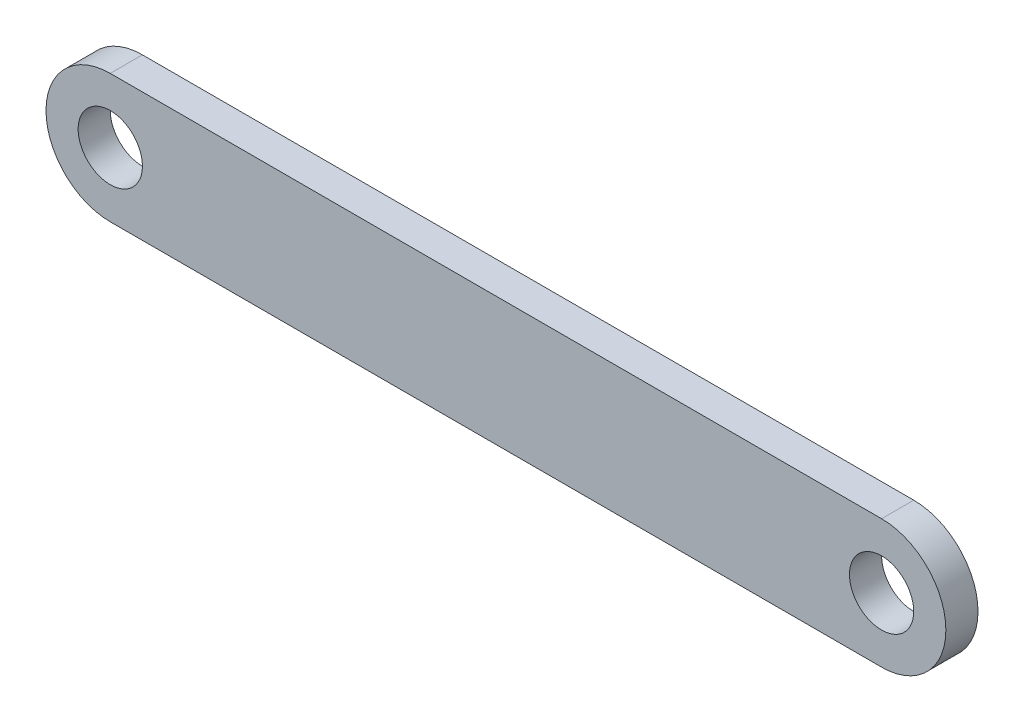
ISO-10303-21;
HEADER;
FILE_DESCRIPTION(('STEP AP214'),'2;1');
FILE_NAME('part.step','',(''),(''),'','','');
FILE_SCHEMA(('AUTOMOTIVE_DESIGN { 1 0 10303 214 1 1 1 1 }'));
ENDSEC;
DATA;
#1=APPLICATION_CONTEXT('core data for automotive mechanical design processes');
#2=APPLICATION_PROTOCOL_DEFINITION('international standard','automotive_design',2000,#1);
#3=PRODUCT_CONTEXT('',#1,'mechanical');
#4=PRODUCT('Part','Part','',(#3));
#5=PRODUCT_RELATED_PRODUCT_CATEGORY('part','',(#4));
#6=PRODUCT_DEFINITION_FORMATION('','',#4);
#7=PRODUCT_DEFINITION_CONTEXT('part definition',#1,'design');
#8=PRODUCT_DEFINITION('design','',#6,#7);
#9=PRODUCT_DEFINITION_SHAPE('','',#8);
#10=(LENGTH_UNIT() NAMED_UNIT(*) SI_UNIT(.MILLI.,.METRE.));
#11=(NAMED_UNIT(*) PLANE_ANGLE_UNIT() SI_UNIT($,.RADIAN.));
#12=(NAMED_UNIT(*) SI_UNIT($,.STERADIAN.) SOLID_ANGLE_UNIT());
#13=UNCERTAINTY_MEASURE_WITH_UNIT(LENGTH_MEASURE(1.E-05),#10,'distance_accuracy_value','');
#14=(GEOMETRIC_REPRESENTATION_CONTEXT(3) GLOBAL_UNCERTAINTY_ASSIGNED_CONTEXT((#13)) GLOBAL_UNIT_ASSIGNED_CONTEXT((#10,
#11,#12)) REPRESENTATION_CONTEXT('',''));
#15=CARTESIAN_POINT('',(0.,0.,0.));
#16=DIRECTION('',(0.,0.,1.));
#17=DIRECTION('',(1.,0.,0.));
#18=AXIS2_PLACEMENT_3D('',#15,#16,#17);
#19=CARTESIAN_POINT('',(60.,0.,5.));
#20=DIRECTION('',(0.,0.,1.));
#21=DIRECTION('',(1.,0.,0.));
#22=AXIS2_PLACEMENT_3D('',#19,#20,#21);
#23=PLANE('',#22);
#24=CARTESIAN_POINT('',(-60.,0.,5.));
#25=DIRECTION('',(0.,0.,1.));
#26=DIRECTION('',(1.,0.,0.));
#27=AXIS2_PLACEMENT_3D('',#24,#25,#26);
#28=CIRCLE('',#27,5.);
#29=CARTESIAN_POINT('',(-55.,0.,5.));
#30=VERTEX_POINT('',#29);
#31=EDGE_CURVE('E100',#30,#30,#28,.T.);
#32=ORIENTED_EDGE('',*,*,#31,.F.);
#33=EDGE_LOOP('',(#32));
#34=FACE_BOUND('',#33,.T.);
#35=CARTESIAN_POINT('',(60.,0.,5.));
#36=DIRECTION('',(0.,0.,1.));
#37=DIRECTION('',(1.,0.,0.));
#38=AXIS2_PLACEMENT_3D('',#35,#36,#37);
#39=CIRCLE('',#38,10.);
#40=CARTESIAN_POINT('',(60.,-9.99999999999997,5.));
#41=VERTEX_POINT('',#40);
#42=CARTESIAN_POINT('',(60.,10.,5.));
#43=VERTEX_POINT('',#42);
#44=EDGE_CURVE('E85',#41,#43,#39,.T.);
#45=ORIENTED_EDGE('',*,*,#44,.T.);
#46=DIRECTION('',(-1.,0.,0.));
#47=VECTOR('',#46,1.);
#48=CARTESIAN_POINT('',(60.,10.,5.));
#49=LINE('',#48,#47);
#50=CARTESIAN_POINT('',(-60.,10.,5.));
#51=VERTEX_POINT('',#50);
#52=EDGE_CURVE('E80',#43,#51,#49,.T.);
#53=ORIENTED_EDGE('',*,*,#52,.T.);
#54=CARTESIAN_POINT('',(-60.,0.,5.));
#55=DIRECTION('',(0.,0.,1.));
#56=DIRECTION('',(1.,0.,0.));
#57=AXIS2_PLACEMENT_3D('',#54,#55,#56);
#58=CIRCLE('',#57,10.);
#59=CARTESIAN_POINT('',(-60.,-9.99999999999998,5.));
#60=VERTEX_POINT('',#59);
#61=EDGE_CURVE('E83',#51,#60,#58,.T.);
#62=ORIENTED_EDGE('',*,*,#61,.T.);
#63=DIRECTION('',(1.,0.,0.));
#64=VECTOR('',#63,1.);
#65=CARTESIAN_POINT('',(60.,-9.99999999999997,5.));
#66=LINE('',#65,#64);
#67=EDGE_CURVE('E50',#60,#41,#66,.T.);
#68=ORIENTED_EDGE('',*,*,#67,.T.);
#69=EDGE_LOOP('',(#45,#53,#62,#68));
#70=FACE_BOUND('',#69,.T.);
#71=CARTESIAN_POINT('',(60.,0.,5.));
#72=DIRECTION('',(0.,0.,1.));
#73=DIRECTION('',(1.,0.,0.));
#74=AXIS2_PLACEMENT_3D('',#71,#72,#73);
#75=CIRCLE('',#74,5.);
#76=CARTESIAN_POINT('',(65.,0.,5.));
#77=VERTEX_POINT('',#76);
#78=EDGE_CURVE('E115',#77,#77,#75,.T.);
#79=ORIENTED_EDGE('',*,*,#78,.F.);
#80=EDGE_LOOP('',(#79));
#81=FACE_BOUND('',#80,.T.);
#82=ADVANCED_FACE('F33',(#34,#70,#81),#23,.T.);
#83=CARTESIAN_POINT('',(60.,0.,0.));
#84=DIRECTION('',(0.,0.,1.));
#85=DIRECTION('',(1.,0.,0.));
#86=AXIS2_PLACEMENT_3D('',#83,#84,#85);
#87=PLANE('',#86);
#88=CARTESIAN_POINT('',(60.,0.,0.));
#89=DIRECTION('',(0.,0.,1.));
#90=DIRECTION('',(1.,0.,0.));
#91=AXIS2_PLACEMENT_3D('',#88,#89,#90);
#92=CIRCLE('',#91,10.);
#93=CARTESIAN_POINT('',(60.,-9.99999999999997,0.));
#94=VERTEX_POINT('',#93);
#95=CARTESIAN_POINT('',(60.,10.,0.));
#96=VERTEX_POINT('',#95);
#97=EDGE_CURVE('E97',#94,#96,#92,.T.);
#98=ORIENTED_EDGE('',*,*,#97,.F.);
#99=DIRECTION('',(1.,0.,0.));
#100=VECTOR('',#99,1.);
#101=CARTESIAN_POINT('',(60.,-9.99999999999997,0.));
#102=LINE('',#101,#100);
#103=CARTESIAN_POINT('',(-60.,-9.99999999999998,0.));
#104=VERTEX_POINT('',#103);
#105=EDGE_CURVE('E73',#104,#94,#102,.T.);
#106=ORIENTED_EDGE('',*,*,#105,.F.);
#107=CARTESIAN_POINT('',(-60.,0.,0.));
#108=DIRECTION('',(0.,0.,1.));
#109=DIRECTION('',(1.,0.,0.));
#110=AXIS2_PLACEMENT_3D('',#107,#108,#109);
#111=CIRCLE('',#110,10.);
#112=CARTESIAN_POINT('',(-60.,10.,0.));
#113=VERTEX_POINT('',#112);
#114=EDGE_CURVE('E67',#113,#104,#111,.T.);
#115=ORIENTED_EDGE('',*,*,#114,.F.);
#116=DIRECTION('',(-1.,0.,0.));
#117=VECTOR('',#116,1.);
#118=CARTESIAN_POINT('',(60.,10.,0.));
#119=LINE('',#118,#117);
#120=EDGE_CURVE('E89',#96,#113,#119,.T.);
#121=ORIENTED_EDGE('',*,*,#120,.F.);
#122=EDGE_LOOP('',(#98,#106,#115,#121));
#123=FACE_BOUND('',#122,.T.);
#124=CARTESIAN_POINT('',(-60.,0.,0.));
#125=DIRECTION('',(0.,0.,1.));
#126=DIRECTION('',(1.,0.,0.));
#127=AXIS2_PLACEMENT_3D('',#124,#125,#126);
#128=CIRCLE('',#127,5.);
#129=CARTESIAN_POINT('',(-55.,0.,0.));
#130=VERTEX_POINT('',#129);
#131=EDGE_CURVE('E112',#130,#130,#128,.T.);
#132=ORIENTED_EDGE('',*,*,#131,.T.);
#133=EDGE_LOOP('',(#132));
#134=FACE_BOUND('',#133,.T.);
#135=CARTESIAN_POINT('',(60.,0.,0.));
#136=DIRECTION('',(0.,0.,1.));
#137=DIRECTION('',(1.,0.,0.));
#138=AXIS2_PLACEMENT_3D('',#135,#136,#137);
#139=CIRCLE('',#138,5.);
#140=CARTESIAN_POINT('',(65.,0.,0.));
#141=VERTEX_POINT('',#140);
#142=EDGE_CURVE('E118',#141,#141,#139,.T.);
#143=ORIENTED_EDGE('',*,*,#142,.T.);
#144=EDGE_LOOP('',(#143));
#145=FACE_BOUND('',#144,.T.);
#146=ADVANCED_FACE('F108',(#123,#134,#145),#87,.F.);
#147=CARTESIAN_POINT('',(60.,0.,5.));
#148=DIRECTION('',(0.,0.,-1.));
#149=DIRECTION('',(-1.,0.,0.));
#150=AXIS2_PLACEMENT_3D('',#147,#148,#149);
#151=CYLINDRICAL_SURFACE('',#150,10.);
#152=ORIENTED_EDGE('',*,*,#97,.T.);
#153=DIRECTION('',(0.,0.,-1.));
#154=VECTOR('',#153,1.);
#155=CARTESIAN_POINT('',(60.,10.,5.));
#156=LINE('',#155,#154);
#157=EDGE_CURVE('E11',#43,#96,#156,.T.);
#158=ORIENTED_EDGE('',*,*,#157,.F.);
#159=ORIENTED_EDGE('',*,*,#44,.F.);
#160=DIRECTION('',(0.,0.,-1.));
#161=VECTOR('',#160,1.);
#162=CARTESIAN_POINT('',(60.,-9.99999999999997,5.));
#163=LINE('',#162,#161);
#164=EDGE_CURVE('E93',#41,#94,#163,.T.);
#165=ORIENTED_EDGE('',*,*,#164,.T.);
#166=EDGE_LOOP('',(#152,#158,#159,#165));
#167=FACE_BOUND('',#166,.T.);
#168=ADVANCED_FACE('F35',(#167),#151,.T.);
#169=CARTESIAN_POINT('',(60.,10.,5.));
#170=DIRECTION('',(0.,-1.,0.));
#171=DIRECTION('',(1.,0.,0.));
#172=AXIS2_PLACEMENT_3D('',#169,#170,#171);
#173=PLANE('',#172);
#174=ORIENTED_EDGE('',*,*,#120,.T.);
#175=DIRECTION('',(0.,0.,-1.));
#176=VECTOR('',#175,1.);
#177=CARTESIAN_POINT('',(-60.,10.,5.));
#178=LINE('',#177,#176);
#179=EDGE_CURVE('E42',#51,#113,#178,.T.);
#180=ORIENTED_EDGE('',*,*,#179,.F.);
#181=ORIENTED_EDGE('',*,*,#52,.F.);
#182=ORIENTED_EDGE('',*,*,#157,.T.);
#183=EDGE_LOOP('',(#174,#180,#181,#182));
#184=FACE_BOUND('',#183,.T.);
#185=ADVANCED_FACE('F88',(#184),#173,.F.);
#186=CARTESIAN_POINT('',(-60.,0.,5.));
#187=DIRECTION('',(0.,0.,-1.));
#188=DIRECTION('',(-1.,0.,0.));
#189=AXIS2_PLACEMENT_3D('',#186,#187,#188);
#190=CYLINDRICAL_SURFACE('',#189,10.);
#191=ORIENTED_EDGE('',*,*,#114,.T.);
#192=DIRECTION('',(0.,0.,-1.));
#193=VECTOR('',#192,1.);
#194=CARTESIAN_POINT('',(-60.,-9.99999999999998,5.));
#195=LINE('',#194,#193);
#196=EDGE_CURVE('E90',#60,#104,#195,.T.);
#197=ORIENTED_EDGE('',*,*,#196,.F.);
#198=ORIENTED_EDGE('',*,*,#61,.F.);
#199=ORIENTED_EDGE('',*,*,#179,.T.);
#200=EDGE_LOOP('',(#191,#197,#198,#199));
#201=FACE_BOUND('',#200,.T.);
#202=ADVANCED_FACE('F91',(#201),#190,.T.);
#203=CARTESIAN_POINT('',(60.,-9.99999999999997,5.));
#204=DIRECTION('',(0.,1.,0.));
#205=DIRECTION('',(-1.,0.,0.));
#206=AXIS2_PLACEMENT_3D('',#203,#204,#205);
#207=PLANE('',#206);
#208=ORIENTED_EDGE('',*,*,#105,.T.);
#209=ORIENTED_EDGE('',*,*,#164,.F.);
#210=ORIENTED_EDGE('',*,*,#67,.F.);
#211=ORIENTED_EDGE('',*,*,#196,.T.);
#212=EDGE_LOOP('',(#208,#209,#210,#211));
#213=FACE_BOUND('',#212,.T.);
#214=ADVANCED_FACE('F105',(#213),#207,.F.);
#215=CARTESIAN_POINT('',(-60.,0.,5.));
#216=DIRECTION('',(0.,0.,-1.));
#217=DIRECTION('',(-1.,0.,0.));
#218=AXIS2_PLACEMENT_3D('',#215,#216,#217);
#219=CYLINDRICAL_SURFACE('',#218,5.);
#220=ORIENTED_EDGE('',*,*,#31,.T.);
#221=EDGE_LOOP('',(#220));
#222=FACE_BOUND('',#221,.T.);
#223=ORIENTED_EDGE('',*,*,#131,.F.);
#224=EDGE_LOOP('',(#223));
#225=FACE_BOUND('',#224,.T.);
#226=ADVANCED_FACE('F135',(#222,#225),#219,.F.);
#227=CARTESIAN_POINT('',(60.,0.,5.));
#228=DIRECTION('',(0.,0.,-1.));
#229=DIRECTION('',(-1.,0.,0.));
#230=AXIS2_PLACEMENT_3D('',#227,#228,#229);
#231=CYLINDRICAL_SURFACE('',#230,5.);
#232=ORIENTED_EDGE('',*,*,#78,.T.);
#233=EDGE_LOOP('',(#232));
#234=FACE_BOUND('',#233,.T.);
#235=ORIENTED_EDGE('',*,*,#142,.F.);
#236=EDGE_LOOP('',(#235));
#237=FACE_BOUND('',#236,.T.);
#238=ADVANCED_FACE('F124',(#234,#237),#231,.F.);
#239=CLOSED_SHELL('',(#82,#146,#168,#185,#202,#214,#226,#238));
#240=MANIFOLD_SOLID_BREP('B2',#239);
#241=ADVANCED_BREP_SHAPE_REPRESENTATION('',(#18,#240),#14);
#242=SHAPE_DEFINITION_REPRESENTATION(#9,#241);
ENDSEC;
END-ISO-10303-21;
